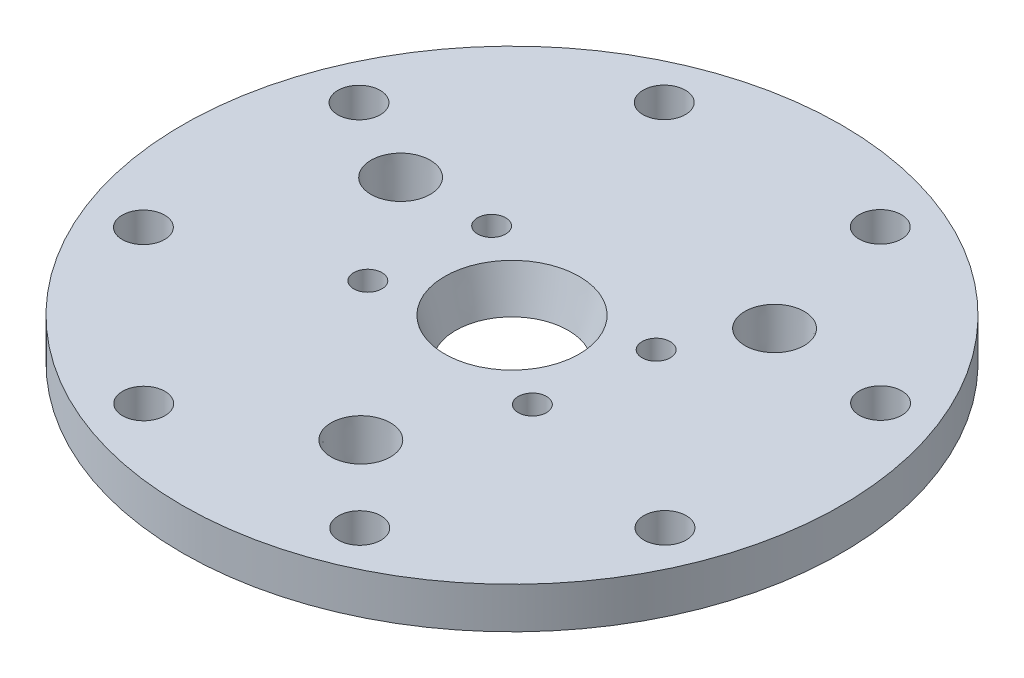
ISO-10303-21;
HEADER;
FILE_DESCRIPTION(('STEP AP214'),'2;1');
FILE_NAME('part.step','',(''),(''),'','','');
FILE_SCHEMA(('AUTOMOTIVE_DESIGN { 1 0 10303 214 1 1 1 1 }'));
ENDSEC;
DATA;
#1=APPLICATION_CONTEXT('core data for automotive mechanical design processes');
#2=APPLICATION_PROTOCOL_DEFINITION('international standard','automotive_design',2000,#1);
#3=PRODUCT_CONTEXT('',#1,'mechanical');
#4=PRODUCT('Part','Part','',(#3));
#5=PRODUCT_RELATED_PRODUCT_CATEGORY('part','',(#4));
#6=PRODUCT_DEFINITION_FORMATION('','',#4);
#7=PRODUCT_DEFINITION_CONTEXT('part definition',#1,'design');
#8=PRODUCT_DEFINITION('design','',#6,#7);
#9=PRODUCT_DEFINITION_SHAPE('','',#8);
#10=(LENGTH_UNIT() NAMED_UNIT(*) SI_UNIT(.MILLI.,.METRE.));
#11=(NAMED_UNIT(*) PLANE_ANGLE_UNIT() SI_UNIT($,.RADIAN.));
#12=(NAMED_UNIT(*) SI_UNIT($,.STERADIAN.) SOLID_ANGLE_UNIT());
#13=UNCERTAINTY_MEASURE_WITH_UNIT(LENGTH_MEASURE(1.E-05),#10,'distance_accuracy_value','');
#14=(GEOMETRIC_REPRESENTATION_CONTEXT(3) GLOBAL_UNCERTAINTY_ASSIGNED_CONTEXT((#13)) GLOBAL_UNIT_ASSIGNED_CONTEXT((#10,
#11,#12)) REPRESENTATION_CONTEXT('',''));
#15=CARTESIAN_POINT('',(0.,0.,0.));
#16=DIRECTION('',(0.,0.,1.));
#17=DIRECTION('',(1.,0.,0.));
#18=AXIS2_PLACEMENT_3D('',#15,#16,#17);
#19=CARTESIAN_POINT('',(0.,0.,0.));
#20=DIRECTION('',(0.,1.,0.));
#21=DIRECTION('',(0.,0.,1.));
#22=AXIS2_PLACEMENT_3D('',#19,#20,#21);
#23=PLANE('',#22);
#24=CARTESIAN_POINT('',(-20.2404270941802,0.,-15.531025957585));
#25=DIRECTION('',(0.,1.,0.));
#26=DIRECTION('',(0.,0.,1.));
#27=AXIS2_PLACEMENT_3D('',#24,#25,#26);
#28=CIRCLE('',#27,3.2639);
#29=CARTESIAN_POINT('',(-20.2404270941802,0.,-12.267125957585));
#30=VERTEX_POINT('',#29);
#31=EDGE_CURVE('E132',#30,#30,#28,.T.);
#32=ORIENTED_EDGE('',*,*,#31,.T.);
#33=EDGE_LOOP('',(#32));
#34=FACE_BOUND('',#33,.T.);
#35=CARTESIAN_POINT('',(20.24042709418,0.,15.531025957585));
#36=DIRECTION('',(0.,1.,0.));
#37=DIRECTION('',(0.,0.,1.));
#38=AXIS2_PLACEMENT_3D('',#35,#36,#37);
#39=CIRCLE('',#38,3.2639);
#40=CARTESIAN_POINT('',(20.24042709418,0.,18.794925957585));
#41=VERTEX_POINT('',#40);
#42=EDGE_CURVE('E126',#41,#41,#39,.T.);
#43=ORIENTED_EDGE('',*,*,#42,.T.);
#44=EDGE_LOOP('',(#43));
#45=FACE_BOUND('',#44,.T.);
#46=CARTESIAN_POINT('',(-23.5704765731943,0.,9.76321106821453));
#47=DIRECTION('',(0.,1.,0.));
#48=DIRECTION('',(0.,0.,1.));
#49=AXIS2_PLACEMENT_3D('',#46,#47,#48);
#50=CIRCLE('',#49,3.2639);
#51=CARTESIAN_POINT('',(-23.5704765731943,0.,13.0271110682145));
#52=VERTEX_POINT('',#51);
#53=EDGE_CURVE('E120',#52,#52,#50,.T.);
#54=ORIENTED_EDGE('',*,*,#53,.T.);
#55=EDGE_LOOP('',(#54));
#56=FACE_BOUND('',#55,.T.);
#57=CARTESIAN_POINT('',(23.570476573194,0.,-9.76321106821436));
#58=DIRECTION('',(0.,1.,0.));
#59=DIRECTION('',(0.,0.,1.));
#60=AXIS2_PLACEMENT_3D('',#57,#58,#59);
#61=CIRCLE('',#60,3.2639);
#62=CARTESIAN_POINT('',(23.570476573194,0.,-6.49931106821436));
#63=VERTEX_POINT('',#62);
#64=EDGE_CURVE('E114',#63,#63,#61,.T.);
#65=ORIENTED_EDGE('',*,*,#64,.T.);
#66=EDGE_LOOP('',(#65));
#67=FACE_BOUND('',#66,.T.);
#68=CARTESIAN_POINT('',(60.2072176605376,0.,-25.0136043709744));
#69=DIRECTION('',(0.,1.,0.));
#70=DIRECTION('',(0.,0.,1.));
#71=AXIS2_PLACEMENT_3D('',#68,#69,#70);
#72=CIRCLE('',#71,4.9022);
#73=CARTESIAN_POINT('',(60.2072176605376,0.,-20.1114043709744));
#74=VERTEX_POINT('',#73);
#75=EDGE_CURVE('E108',#74,#74,#72,.T.);
#76=ORIENTED_EDGE('',*,*,#75,.T.);
#77=EDGE_LOOP('',(#76));
#78=FACE_BOUND('',#77,.T.);
#79=CARTESIAN_POINT('',(60.2573748005619,0.,24.8884947052938));
#80=DIRECTION('',(0.,1.,0.));
#81=DIRECTION('',(0.,0.,1.));
#82=AXIS2_PLACEMENT_3D('',#79,#80,#81);
#83=CIRCLE('',#82,4.9022);
#84=CARTESIAN_POINT('',(60.2573748005619,0.,29.7906947052938));
#85=VERTEX_POINT('',#84);
#86=EDGE_CURVE('E102',#85,#85,#83,.T.);
#87=ORIENTED_EDGE('',*,*,#86,.T.);
#88=EDGE_LOOP('',(#87));
#89=FACE_BOUND('',#88,.T.);
#90=CARTESIAN_POINT('',(24.8856385511014,0.,-60.2642505633118));
#91=DIRECTION('',(0.,1.,0.));
#92=DIRECTION('',(0.,0.,1.));
#93=AXIS2_PLACEMENT_3D('',#90,#91,#92);
#94=CIRCLE('',#93,4.9022);
#95=CARTESIAN_POINT('',(24.8856385511014,0.,-55.3620505633118));
#96=VERTEX_POINT('',#95);
#97=EDGE_CURVE('E96',#96,#96,#94,.T.);
#98=ORIENTED_EDGE('',*,*,#97,.T.);
#99=EDGE_LOOP('',(#98));
#100=FACE_BOUND('',#99,.T.);
#101=CARTESIAN_POINT('',(-25.0164605137829,0.,-60.2140934213461));
#102=DIRECTION('',(0.,1.,0.));
#103=DIRECTION('',(0.,0.,1.));
#104=AXIS2_PLACEMENT_3D('',#101,#102,#103);
#105=CIRCLE('',#104,4.9022);
#106=CARTESIAN_POINT('',(-25.0164605137829,0.,-55.3118934213461));
#107=VERTEX_POINT('',#106);
#108=EDGE_CURVE('E90',#107,#107,#105,.T.);
#109=ORIENTED_EDGE('',*,*,#108,.T.);
#110=EDGE_LOOP('',(#109));
#111=FACE_BOUND('',#110,.T.);
#112=CARTESIAN_POINT('',(-60.2671066994754,0.,-24.8925143346813));
#113=DIRECTION('',(0.,1.,0.));
#114=DIRECTION('',(0.,0.,1.));
#115=AXIS2_PLACEMENT_3D('',#112,#113,#114);
#116=CIRCLE('',#115,4.9022);
#117=CARTESIAN_POINT('',(-60.2671066994754,0.,-19.9903143346813));
#118=VERTEX_POINT('',#117);
#119=EDGE_CURVE('E84',#118,#118,#116,.T.);
#120=ORIENTED_EDGE('',*,*,#119,.T.);
#121=EDGE_LOOP('',(#120));
#122=FACE_BOUND('',#121,.T.);
#123=CARTESIAN_POINT('',(-60.2169495689037,0.,25.0095847188311));
#124=DIRECTION('',(0.,1.,0.));
#125=DIRECTION('',(0.,0.,1.));
#126=AXIS2_PLACEMENT_3D('',#123,#124,#125);
#127=CIRCLE('',#126,4.9022);
#128=CARTESIAN_POINT('',(-60.2169495689037,0.,29.9117847188311));
#129=VERTEX_POINT('',#128);
#130=EDGE_CURVE('E78',#129,#129,#127,.T.);
#131=ORIENTED_EDGE('',*,*,#130,.T.);
#132=EDGE_LOOP('',(#131));
#133=FACE_BOUND('',#132,.T.);
#134=CARTESIAN_POINT('',(-24.8953704822231,0.,60.2602309206212));
#135=DIRECTION('',(0.,1.,0.));
#136=DIRECTION('',(0.,0.,1.));
#137=AXIS2_PLACEMENT_3D('',#134,#135,#136);
#138=CIRCLE('',#137,4.9022);
#139=CARTESIAN_POINT('',(-24.8953704822231,0.,65.1624309206212));
#140=VERTEX_POINT('',#139);
#141=EDGE_CURVE('E72',#140,#140,#138,.T.);
#142=ORIENTED_EDGE('',*,*,#141,.T.);
#143=EDGE_LOOP('',(#142));
#144=FACE_BOUND('',#143,.T.);
#145=CARTESIAN_POINT('',(25.0067285921135,0.,60.2100738014111));
#146=DIRECTION('',(0.,1.,0.));
#147=DIRECTION('',(0.,0.,1.));
#148=AXIS2_PLACEMENT_3D('',#145,#146,#147);
#149=CIRCLE('',#148,4.9022);
#150=CARTESIAN_POINT('',(25.0067285921135,0.,65.1122738014111));
#151=VERTEX_POINT('',#150);
#152=EDGE_CURVE('E66',#151,#151,#149,.T.);
#153=ORIENTED_EDGE('',*,*,#152,.T.);
#154=EDGE_LOOP('',(#153));
#155=FACE_BOUND('',#154,.T.);
#156=CARTESIAN_POINT('',(7.48315115633477,0.,42.4390591063698));
#157=DIRECTION('',(0.,1.,0.));
#158=DIRECTION('',(0.,0.,1.));
#159=AXIS2_PLACEMENT_3D('',#156,#157,#158);
#160=CIRCLE('',#159,6.57280874440069);
#161=CARTESIAN_POINT('',(7.48315115633477,0.,49.0118678507704));
#162=VERTEX_POINT('',#161);
#163=EDGE_CURVE('E60',#162,#162,#160,.T.);
#164=ORIENTED_EDGE('',*,*,#163,.T.);
#165=EDGE_LOOP('',(#164));
#166=FACE_BOUND('',#165,.T.);
#167=CARTESIAN_POINT('',(-40.4948788769928,0.,-14.7389305514403));
#168=DIRECTION('',(0.,1.,0.));
#169=DIRECTION('',(0.,0.,1.));
#170=AXIS2_PLACEMENT_3D('',#167,#168,#169);
#171=CIRCLE('',#170,6.57280874440069);
#172=CARTESIAN_POINT('',(-40.4948788769928,0.,-8.16612180703957));
#173=VERTEX_POINT('',#172);
#174=EDGE_CURVE('E54',#173,#173,#171,.T.);
#175=ORIENTED_EDGE('',*,*,#174,.T.);
#176=EDGE_LOOP('',(#175));
#177=FACE_BOUND('',#176,.T.);
#178=CARTESIAN_POINT('',(33.0117277206584,0.,-27.7001285549294));
#179=DIRECTION('',(0.,1.,0.));
#180=DIRECTION('',(0.,0.,1.));
#181=AXIS2_PLACEMENT_3D('',#178,#179,#180);
#182=CIRCLE('',#181,6.57280874440069);
#183=CARTESIAN_POINT('',(33.0117277206584,0.,-21.1273198105287));
#184=VERTEX_POINT('',#183);
#185=EDGE_CURVE('E35',#184,#184,#182,.T.);
#186=ORIENTED_EDGE('',*,*,#185,.T.);
#187=EDGE_LOOP('',(#186));
#188=FACE_BOUND('',#187,.T.);
#189=CARTESIAN_POINT('',(0.,0.,0.));
#190=DIRECTION('',(0.,-1.,0.));
#191=DIRECTION('',(0.,0.,-1.));
#192=AXIS2_PLACEMENT_3D('',#189,#190,#191);
#193=CIRCLE('',#192,13.);
#194=CARTESIAN_POINT('',(0.,0.,-13.));
#195=VERTEX_POINT('',#194);
#196=EDGE_CURVE('E44',#195,#195,#193,.T.);
#197=ORIENTED_EDGE('',*,*,#196,.F.);
#198=EDGE_LOOP('',(#197));
#199=FACE_BOUND('',#198,.T.);
#200=CARTESIAN_POINT('',(0.,0.,0.));
#201=DIRECTION('',(0.,1.,0.));
#202=DIRECTION('',(0.,0.,1.));
#203=AXIS2_PLACEMENT_3D('',#200,#201,#202);
#204=CIRCLE('',#203,76.2);
#205=CARTESIAN_POINT('',(0.,0.,-76.2));
#206=VERTEX_POINT('',#205);
#207=EDGE_CURVE('E39',#206,#206,#204,.T.);
#208=ORIENTED_EDGE('',*,*,#207,.F.);
#209=EDGE_LOOP('',(#208));
#210=FACE_BOUND('',#209,.T.);
#211=ADVANCED_FACE('F31',(#34,#45,#56,#67,#78,#89,#100,#111,#122,#133,#144,#155,#166,#177,#188,
#199,#210),#23,.F.);
#212=CARTESIAN_POINT('',(0.,9.525,0.));
#213=DIRECTION('',(0.,-1.,0.));
#214=DIRECTION('',(0.,0.,-1.));
#215=AXIS2_PLACEMENT_3D('',#212,#213,#214);
#216=CYLINDRICAL_SURFACE('',#215,76.2);
#217=CARTESIAN_POINT('',(0.,9.525,0.));
#218=DIRECTION('',(0.,1.,0.));
#219=DIRECTION('',(0.,0.,1.));
#220=AXIS2_PLACEMENT_3D('',#217,#218,#219);
#221=CIRCLE('',#220,76.2);
#222=CARTESIAN_POINT('',(0.,9.525,-76.2));
#223=VERTEX_POINT('',#222);
#224=EDGE_CURVE('E10',#223,#223,#221,.T.);
#225=CARTESIAN_POINT('',(0.,9.525,-76.2));
#226=CARTESIAN_POINT('',(0.,9.42578125,-76.2));
#227=CARTESIAN_POINT('',(0.,9.3265625,-76.2));
#228=CARTESIAN_POINT('',(0.,9.128125,-76.2));
#229=CARTESIAN_POINT('',(0.,9.02890625,-76.2));
#230=CARTESIAN_POINT('',(0.,8.83046875,-76.2));
#231=CARTESIAN_POINT('',(0.,8.73125,-76.2));
#232=CARTESIAN_POINT('',(0.,8.5328125,-76.2));
#233=CARTESIAN_POINT('',(0.,8.43359375,-76.2));
#234=CARTESIAN_POINT('',(0.,8.23515625,-76.2));
#235=CARTESIAN_POINT('',(0.,8.1359375,-76.2));
#236=CARTESIAN_POINT('',(0.,7.9375,-76.2));
#237=CARTESIAN_POINT('',(0.,7.83828125,-76.2));
#238=CARTESIAN_POINT('',(0.,7.63984375,-76.2));
#239=CARTESIAN_POINT('',(0.,7.540625,-76.2));
#240=CARTESIAN_POINT('',(0.,7.3421875,-76.2));
#241=CARTESIAN_POINT('',(0.,7.24296875,-76.2));
#242=CARTESIAN_POINT('',(0.,7.04453125,-76.2));
#243=CARTESIAN_POINT('',(0.,6.9453125,-76.2));
#244=CARTESIAN_POINT('',(0.,6.746875,-76.2));
#245=CARTESIAN_POINT('',(0.,6.64765625,-76.2));
#246=CARTESIAN_POINT('',(0.,6.44921875,-76.2));
#247=CARTESIAN_POINT('',(0.,6.35,-76.2));
#248=CARTESIAN_POINT('',(0.,6.1515625,-76.2));
#249=CARTESIAN_POINT('',(0.,6.05234375,-76.2));
#250=CARTESIAN_POINT('',(0.,5.85390625,-76.2));
#251=CARTESIAN_POINT('',(0.,5.7546875,-76.2));
#252=CARTESIAN_POINT('',(0.,5.55625,-76.2));
#253=CARTESIAN_POINT('',(0.,5.45703125,-76.2));
#254=CARTESIAN_POINT('',(0.,5.25859375,-76.2));
#255=CARTESIAN_POINT('',(0.,5.159375,-76.2));
#256=CARTESIAN_POINT('',(0.,4.9609375,-76.2));
#257=CARTESIAN_POINT('',(0.,4.86171875,-76.2));
#258=CARTESIAN_POINT('',(0.,4.66328125,-76.2));
#259=CARTESIAN_POINT('',(0.,4.5640625,-76.2));
#260=CARTESIAN_POINT('',(0.,4.365625,-76.2));
#261=CARTESIAN_POINT('',(0.,4.26640625,-76.2));
#262=CARTESIAN_POINT('',(0.,4.06796875,-76.2));
#263=CARTESIAN_POINT('',(0.,3.96875,-76.2));
#264=CARTESIAN_POINT('',(0.,3.7703125,-76.2));
#265=CARTESIAN_POINT('',(0.,3.67109375,-76.2));
#266=CARTESIAN_POINT('',(0.,3.47265625,-76.2));
#267=CARTESIAN_POINT('',(0.,3.3734375,-76.2));
#268=CARTESIAN_POINT('',(0.,3.175,-76.2));
#269=CARTESIAN_POINT('',(0.,3.07578125,-76.2));
#270=CARTESIAN_POINT('',(0.,2.87734375,-76.2));
#271=CARTESIAN_POINT('',(0.,2.778125,-76.2));
#272=CARTESIAN_POINT('',(0.,2.5796875,-76.2));
#273=CARTESIAN_POINT('',(0.,2.48046875,-76.2));
#274=CARTESIAN_POINT('',(0.,2.28203125,-76.2));
#275=CARTESIAN_POINT('',(0.,2.1828125,-76.2));
#276=CARTESIAN_POINT('',(0.,1.984375,-76.2));
#277=CARTESIAN_POINT('',(0.,1.88515625,-76.2));
#278=CARTESIAN_POINT('',(0.,1.68671875,-76.2));
#279=CARTESIAN_POINT('',(0.,1.5875,-76.2));
#280=CARTESIAN_POINT('',(0.,1.3890625,-76.2));
#281=CARTESIAN_POINT('',(0.,1.28984375,-76.2));
#282=CARTESIAN_POINT('',(0.,1.09140625,-76.2));
#283=CARTESIAN_POINT('',(0.,0.992187500000001,-76.2));
#284=CARTESIAN_POINT('',(0.,0.793750000000001,-76.2));
#285=CARTESIAN_POINT('',(0.,0.69453125,-76.2));
#286=CARTESIAN_POINT('',(0.,0.49609375,-76.2));
#287=CARTESIAN_POINT('',(0.,0.396875,-76.2));
#288=CARTESIAN_POINT('',(0.,0.1984375,-76.2));
#289=CARTESIAN_POINT('',(0.,0.0992187500000001,-76.2));
#290=CARTESIAN_POINT('',(0.,0.,-76.2));
#291=B_SPLINE_CURVE_WITH_KNOTS('',3,(#225,#226,#227,#228,#229,#230,#231,#232,#233,#234,#235,
#236,#237,#238,#239,#240,#241,#242,#243,#244,#245,#246,#247,#248,#249,#250,#251,#252,#253,#254,
#255,#256,#257,#258,#259,#260,#261,#262,#263,#264,#265,#266,#267,#268,#269,#270,#271,#272,#273,
#274,#275,#276,#277,#278,#279,#280,#281,#282,#283,#284,#285,#286,#287,#288,#289,#290),
.UNSPECIFIED.,.F.,.F.,(4,2,2,2,2,2,2,2,2,2,2,2,2,2,2,2,2,2,2,2,2,2,2,2,2,2,2,2,2,2,2,2,4),(0.,
0.29765625,0.5953125,0.892968750000001,1.190625,1.48828125,1.7859375,2.08359375,2.38125,
2.67890625,2.9765625,3.27421875,3.571875,3.86953125,4.1671875,4.46484375,4.7625,5.06015625,
5.3578125,5.65546875,5.953125,6.25078125,6.5484375,6.84609375,7.14375,7.44140625,7.7390625,
8.03671875,8.334375,8.63203125,8.9296875,9.22734375,9.525),.UNSPECIFIED.);
#292=EDGE_CURVE('BSEAM33',#223,#206,#291,.T.);
#293=ORIENTED_EDGE('',*,*,#224,.F.);
#294=ORIENTED_EDGE('',*,*,#207,.T.);
#295=ORIENTED_EDGE('',*,*,#292,.T.);
#296=ORIENTED_EDGE('',*,*,#292,.F.);
#297=EDGE_LOOP('',(#293,#295,#294,#296));
#298=FACE_BOUND('',#297,.T.);
#299=ADVANCED_FACE('F33',(#298),#216,.T.);
#300=CARTESIAN_POINT('',(0.,9.525,0.));
#301=DIRECTION('',(0.,1.,0.));
#302=DIRECTION('',(0.,0.,1.));
#303=AXIS2_PLACEMENT_3D('',#300,#301,#302);
#304=PLANE('',#303);
#305=CARTESIAN_POINT('',(-20.2404270941802,9.525,-15.531025957585));
#306=DIRECTION('',(0.,1.,0.));
#307=DIRECTION('',(0.,0.,1.));
#308=AXIS2_PLACEMENT_3D('',#305,#306,#307);
#309=CIRCLE('',#308,3.2639);
#310=CARTESIAN_POINT('',(-20.2404270941802,9.525,-12.267125957585));
#311=VERTEX_POINT('',#310);
#312=EDGE_CURVE('E135',#311,#311,#309,.T.);
#313=ORIENTED_EDGE('',*,*,#312,.F.);
#314=EDGE_LOOP('',(#313));
#315=FACE_BOUND('',#314,.T.);
#316=CARTESIAN_POINT('',(20.24042709418,9.525,15.531025957585));
#317=DIRECTION('',(0.,1.,0.));
#318=DIRECTION('',(0.,0.,1.));
#319=AXIS2_PLACEMENT_3D('',#316,#317,#318);
#320=CIRCLE('',#319,3.2639);
#321=CARTESIAN_POINT('',(20.24042709418,9.525,18.794925957585));
#322=VERTEX_POINT('',#321);
#323=EDGE_CURVE('E129',#322,#322,#320,.T.);
#324=ORIENTED_EDGE('',*,*,#323,.F.);
#325=EDGE_LOOP('',(#324));
#326=FACE_BOUND('',#325,.T.);
#327=CARTESIAN_POINT('',(-23.5704765731943,9.525,9.76321106821453));
#328=DIRECTION('',(0.,1.,0.));
#329=DIRECTION('',(0.,0.,1.));
#330=AXIS2_PLACEMENT_3D('',#327,#328,#329);
#331=CIRCLE('',#330,3.2639);
#332=CARTESIAN_POINT('',(-23.5704765731943,9.525,13.0271110682145));
#333=VERTEX_POINT('',#332);
#334=EDGE_CURVE('E123',#333,#333,#331,.T.);
#335=ORIENTED_EDGE('',*,*,#334,.F.);
#336=EDGE_LOOP('',(#335));
#337=FACE_BOUND('',#336,.T.);
#338=CARTESIAN_POINT('',(23.570476573194,9.525,-9.76321106821436));
#339=DIRECTION('',(0.,1.,0.));
#340=DIRECTION('',(0.,0.,1.));
#341=AXIS2_PLACEMENT_3D('',#338,#339,#340);
#342=CIRCLE('',#341,3.2639);
#343=CARTESIAN_POINT('',(23.570476573194,9.525,-6.49931106821437));
#344=VERTEX_POINT('',#343);
#345=EDGE_CURVE('E117',#344,#344,#342,.T.);
#346=ORIENTED_EDGE('',*,*,#345,.F.);
#347=EDGE_LOOP('',(#346));
#348=FACE_BOUND('',#347,.T.);
#349=CARTESIAN_POINT('',(60.2072176605376,9.525,-25.0136043709744));
#350=DIRECTION('',(0.,1.,0.));
#351=DIRECTION('',(0.,0.,1.));
#352=AXIS2_PLACEMENT_3D('',#349,#350,#351);
#353=CIRCLE('',#352,4.9022);
#354=CARTESIAN_POINT('',(60.2072176605376,9.525,-20.1114043709744));
#355=VERTEX_POINT('',#354);
#356=EDGE_CURVE('E111',#355,#355,#353,.T.);
#357=ORIENTED_EDGE('',*,*,#356,.F.);
#358=EDGE_LOOP('',(#357));
#359=FACE_BOUND('',#358,.T.);
#360=CARTESIAN_POINT('',(60.2573748005619,9.525,24.8884947052938));
#361=DIRECTION('',(0.,1.,0.));
#362=DIRECTION('',(0.,0.,1.));
#363=AXIS2_PLACEMENT_3D('',#360,#361,#362);
#364=CIRCLE('',#363,4.9022);
#365=CARTESIAN_POINT('',(60.2573748005619,9.525,29.7906947052938));
#366=VERTEX_POINT('',#365);
#367=EDGE_CURVE('E105',#366,#366,#364,.T.);
#368=ORIENTED_EDGE('',*,*,#367,.F.);
#369=EDGE_LOOP('',(#368));
#370=FACE_BOUND('',#369,.T.);
#371=CARTESIAN_POINT('',(24.8856385511014,9.525,-60.2642505633118));
#372=DIRECTION('',(0.,1.,0.));
#373=DIRECTION('',(0.,0.,1.));
#374=AXIS2_PLACEMENT_3D('',#371,#372,#373);
#375=CIRCLE('',#374,4.9022);
#376=CARTESIAN_POINT('',(24.8856385511014,9.525,-55.3620505633118));
#377=VERTEX_POINT('',#376);
#378=EDGE_CURVE('E99',#377,#377,#375,.T.);
#379=ORIENTED_EDGE('',*,*,#378,.F.);
#380=EDGE_LOOP('',(#379));
#381=FACE_BOUND('',#380,.T.);
#382=CARTESIAN_POINT('',(-25.0164605137829,9.525,-60.2140934213461));
#383=DIRECTION('',(0.,1.,0.));
#384=DIRECTION('',(0.,0.,1.));
#385=AXIS2_PLACEMENT_3D('',#382,#383,#384);
#386=CIRCLE('',#385,4.9022);
#387=CARTESIAN_POINT('',(-25.0164605137829,9.525,-55.3118934213461));
#388=VERTEX_POINT('',#387);
#389=EDGE_CURVE('E93',#388,#388,#386,.T.);
#390=ORIENTED_EDGE('',*,*,#389,.F.);
#391=EDGE_LOOP('',(#390));
#392=FACE_BOUND('',#391,.T.);
#393=CARTESIAN_POINT('',(-60.2671066994754,9.525,-24.8925143346813));
#394=DIRECTION('',(0.,1.,0.));
#395=DIRECTION('',(0.,0.,1.));
#396=AXIS2_PLACEMENT_3D('',#393,#394,#395);
#397=CIRCLE('',#396,4.9022);
#398=CARTESIAN_POINT('',(-60.2671066994754,9.525,-19.9903143346813));
#399=VERTEX_POINT('',#398);
#400=EDGE_CURVE('E87',#399,#399,#397,.T.);
#401=ORIENTED_EDGE('',*,*,#400,.F.);
#402=EDGE_LOOP('',(#401));
#403=FACE_BOUND('',#402,.T.);
#404=CARTESIAN_POINT('',(-60.2169495689037,9.525,25.0095847188311));
#405=DIRECTION('',(0.,1.,0.));
#406=DIRECTION('',(0.,0.,1.));
#407=AXIS2_PLACEMENT_3D('',#404,#405,#406);
#408=CIRCLE('',#407,4.9022);
#409=CARTESIAN_POINT('',(-60.2169495689037,9.525,29.9117847188311));
#410=VERTEX_POINT('',#409);
#411=EDGE_CURVE('E81',#410,#410,#408,.T.);
#412=ORIENTED_EDGE('',*,*,#411,.F.);
#413=EDGE_LOOP('',(#412));
#414=FACE_BOUND('',#413,.T.);
#415=CARTESIAN_POINT('',(-24.8953704822231,9.525,60.2602309206212));
#416=DIRECTION('',(0.,1.,0.));
#417=DIRECTION('',(0.,0.,1.));
#418=AXIS2_PLACEMENT_3D('',#415,#416,#417);
#419=CIRCLE('',#418,4.9022);
#420=CARTESIAN_POINT('',(-24.8953704822231,9.525,65.1624309206212));
#421=VERTEX_POINT('',#420);
#422=EDGE_CURVE('E75',#421,#421,#419,.T.);
#423=ORIENTED_EDGE('',*,*,#422,.F.);
#424=EDGE_LOOP('',(#423));
#425=FACE_BOUND('',#424,.T.);
#426=CARTESIAN_POINT('',(25.0067285921135,9.525,60.2100738014111));
#427=DIRECTION('',(0.,1.,0.));
#428=DIRECTION('',(0.,0.,1.));
#429=AXIS2_PLACEMENT_3D('',#426,#427,#428);
#430=CIRCLE('',#429,4.9022);
#431=CARTESIAN_POINT('',(25.0067285921135,9.525,65.1122738014111));
#432=VERTEX_POINT('',#431);
#433=EDGE_CURVE('E69',#432,#432,#430,.T.);
#434=ORIENTED_EDGE('',*,*,#433,.F.);
#435=EDGE_LOOP('',(#434));
#436=FACE_BOUND('',#435,.T.);
#437=CARTESIAN_POINT('',(7.48315115633477,9.525,42.4390591063698));
#438=DIRECTION('',(0.,1.,0.));
#439=DIRECTION('',(0.,0.,1.));
#440=AXIS2_PLACEMENT_3D('',#437,#438,#439);
#441=CIRCLE('',#440,6.858);
#442=CARTESIAN_POINT('',(7.48315115633477,9.525,49.2970591063698));
#443=VERTEX_POINT('',#442);
#444=EDGE_CURVE('E63',#443,#443,#441,.T.);
#445=ORIENTED_EDGE('',*,*,#444,.F.);
#446=EDGE_LOOP('',(#445));
#447=FACE_BOUND('',#446,.T.);
#448=CARTESIAN_POINT('',(-40.4948788769928,9.525,-14.7389305514403));
#449=DIRECTION('',(0.,1.,0.));
#450=DIRECTION('',(0.,0.,1.));
#451=AXIS2_PLACEMENT_3D('',#448,#449,#450);
#452=CIRCLE('',#451,6.858);
#453=CARTESIAN_POINT('',(-40.4948788769928,9.525,-7.88093055144026));
#454=VERTEX_POINT('',#453);
#455=EDGE_CURVE('E57',#454,#454,#452,.T.);
#456=ORIENTED_EDGE('',*,*,#455,.F.);
#457=EDGE_LOOP('',(#456));
#458=FACE_BOUND('',#457,.T.);
#459=CARTESIAN_POINT('',(33.0117277206584,9.525,-27.7001285549294));
#460=DIRECTION('',(0.,1.,0.));
#461=DIRECTION('',(0.,0.,1.));
#462=AXIS2_PLACEMENT_3D('',#459,#460,#461);
#463=CIRCLE('',#462,6.858);
#464=CARTESIAN_POINT('',(33.0117277206584,9.525,-20.8421285549294));
#465=VERTEX_POINT('',#464);
#466=EDGE_CURVE('E51',#465,#465,#463,.T.);
#467=ORIENTED_EDGE('',*,*,#466,.F.);
#468=EDGE_LOOP('',(#467));
#469=FACE_BOUND('',#468,.T.);
#470=CARTESIAN_POINT('',(0.,9.525,0.));
#471=DIRECTION('',(0.,-1.,0.));
#472=DIRECTION('',(0.,0.,-1.));
#473=AXIS2_PLACEMENT_3D('',#470,#471,#472);
#474=CIRCLE('',#473,15.5522160579064);
#475=CARTESIAN_POINT('',(0.,9.525,-15.5522160579064));
#476=VERTEX_POINT('',#475);
#477=EDGE_CURVE('E48',#476,#476,#474,.T.);
#478=ORIENTED_EDGE('',*,*,#477,.T.);
#479=EDGE_LOOP('',(#478));
#480=FACE_BOUND('',#479,.T.);
#481=ORIENTED_EDGE('',*,*,#224,.T.);
#482=EDGE_LOOP('',(#481));
#483=FACE_BOUND('',#482,.T.);
#484=ADVANCED_FACE('F141',(#315,#326,#337,#348,#359,#370,#381,#392,#403,#414,#425,#436,#447,
#458,#469,#480,#483),#304,.T.);
#485=CARTESIAN_POINT('',(0.,0.,0.));
#486=DIRECTION('',(0.,1.,0.));
#487=DIRECTION('',(0.,0.,1.));
#488=AXIS2_PLACEMENT_3D('',#485,#486,#487);
#489=CONICAL_SURFACE('',#488,13.,0.261799387799149);
#490=ORIENTED_EDGE('',*,*,#477,.F.);
#491=EDGE_LOOP('',(#490));
#492=FACE_BOUND('',#491,.T.);
#493=ORIENTED_EDGE('',*,*,#196,.T.);
#494=EDGE_LOOP('',(#493));
#495=FACE_BOUND('',#494,.T.);
#496=ADVANCED_FACE('F144',(#492,#495),#489,.F.);
#497=CARTESIAN_POINT('',(33.0117277206584,9.525,-27.7001285549294));
#498=DIRECTION('',(0.,1.,0.));
#499=DIRECTION('',(0.,0.,1.));
#500=AXIS2_PLACEMENT_3D('',#497,#498,#499);
#501=CONICAL_SURFACE('',#500,6.858,0.0299323966717029);
#502=ORIENTED_EDGE('',*,*,#466,.T.);
#503=EDGE_LOOP('',(#502));
#504=FACE_BOUND('',#503,.T.);
#505=ORIENTED_EDGE('',*,*,#185,.F.);
#506=EDGE_LOOP('',(#505));
#507=FACE_BOUND('',#506,.T.);
#508=ADVANCED_FACE('F178',(#504,#507),#501,.F.);
#509=CARTESIAN_POINT('',(-40.4948788769928,9.525,-14.7389305514403));
#510=DIRECTION('',(0.,1.,0.));
#511=DIRECTION('',(0.,0.,1.));
#512=AXIS2_PLACEMENT_3D('',#509,#510,#511);
#513=CONICAL_SURFACE('',#512,6.858,0.0299323966717029);
#514=ORIENTED_EDGE('',*,*,#455,.T.);
#515=EDGE_LOOP('',(#514));
#516=FACE_BOUND('',#515,.T.);
#517=ORIENTED_EDGE('',*,*,#174,.F.);
#518=EDGE_LOOP('',(#517));
#519=FACE_BOUND('',#518,.T.);
#520=ADVANCED_FACE('F208',(#516,#519),#513,.F.);
#521=CARTESIAN_POINT('',(7.48315115633477,9.525,42.4390591063698));
#522=DIRECTION('',(0.,1.,0.));
#523=DIRECTION('',(0.,0.,1.));
#524=AXIS2_PLACEMENT_3D('',#521,#522,#523);
#525=CONICAL_SURFACE('',#524,6.858,0.0299323966717028);
#526=ORIENTED_EDGE('',*,*,#444,.T.);
#527=EDGE_LOOP('',(#526));
#528=FACE_BOUND('',#527,.T.);
#529=ORIENTED_EDGE('',*,*,#163,.F.);
#530=EDGE_LOOP('',(#529));
#531=FACE_BOUND('',#530,.T.);
#532=ADVANCED_FACE('F216',(#528,#531),#525,.F.);
#533=CARTESIAN_POINT('',(25.0067285921135,9.525,60.2100738014111));
#534=DIRECTION('',(0.,1.,0.));
#535=DIRECTION('',(0.,0.,1.));
#536=AXIS2_PLACEMENT_3D('',#533,#534,#535);
#537=CYLINDRICAL_SURFACE('',#536,4.9022);
#538=ORIENTED_EDGE('',*,*,#152,.F.);
#539=EDGE_LOOP('',(#538));
#540=FACE_BOUND('',#539,.T.);
#541=ORIENTED_EDGE('',*,*,#433,.T.);
#542=EDGE_LOOP('',(#541));
#543=FACE_BOUND('',#542,.T.);
#544=ADVANCED_FACE('F224',(#540,#543),#537,.F.);
#545=CARTESIAN_POINT('',(-24.8953704822231,9.525,60.2602309206212));
#546=DIRECTION('',(0.,1.,0.));
#547=DIRECTION('',(0.,0.,1.));
#548=AXIS2_PLACEMENT_3D('',#545,#546,#547);
#549=CYLINDRICAL_SURFACE('',#548,4.9022);
#550=ORIENTED_EDGE('',*,*,#141,.F.);
#551=EDGE_LOOP('',(#550));
#552=FACE_BOUND('',#551,.T.);
#553=ORIENTED_EDGE('',*,*,#422,.T.);
#554=EDGE_LOOP('',(#553));
#555=FACE_BOUND('',#554,.T.);
#556=ADVANCED_FACE('F232',(#552,#555),#549,.F.);
#557=CARTESIAN_POINT('',(-60.2169495689037,9.525,25.0095847188311));
#558=DIRECTION('',(0.,1.,0.));
#559=DIRECTION('',(0.,0.,1.));
#560=AXIS2_PLACEMENT_3D('',#557,#558,#559);
#561=CYLINDRICAL_SURFACE('',#560,4.9022);
#562=ORIENTED_EDGE('',*,*,#130,.F.);
#563=EDGE_LOOP('',(#562));
#564=FACE_BOUND('',#563,.T.);
#565=ORIENTED_EDGE('',*,*,#411,.T.);
#566=EDGE_LOOP('',(#565));
#567=FACE_BOUND('',#566,.T.);
#568=ADVANCED_FACE('F240',(#564,#567),#561,.F.);
#569=CARTESIAN_POINT('',(-60.2671066994754,9.525,-24.8925143346813));
#570=DIRECTION('',(0.,1.,0.));
#571=DIRECTION('',(0.,0.,1.));
#572=AXIS2_PLACEMENT_3D('',#569,#570,#571);
#573=CYLINDRICAL_SURFACE('',#572,4.9022);
#574=ORIENTED_EDGE('',*,*,#119,.F.);
#575=EDGE_LOOP('',(#574));
#576=FACE_BOUND('',#575,.T.);
#577=ORIENTED_EDGE('',*,*,#400,.T.);
#578=EDGE_LOOP('',(#577));
#579=FACE_BOUND('',#578,.T.);
#580=ADVANCED_FACE('F248',(#576,#579),#573,.F.);
#581=CARTESIAN_POINT('',(-25.0164605137829,9.525,-60.2140934213461));
#582=DIRECTION('',(0.,1.,0.));
#583=DIRECTION('',(0.,0.,1.));
#584=AXIS2_PLACEMENT_3D('',#581,#582,#583);
#585=CYLINDRICAL_SURFACE('',#584,4.9022);
#586=ORIENTED_EDGE('',*,*,#108,.F.);
#587=EDGE_LOOP('',(#586));
#588=FACE_BOUND('',#587,.T.);
#589=ORIENTED_EDGE('',*,*,#389,.T.);
#590=EDGE_LOOP('',(#589));
#591=FACE_BOUND('',#590,.T.);
#592=ADVANCED_FACE('F256',(#588,#591),#585,.F.);
#593=CARTESIAN_POINT('',(24.8856385511014,9.525,-60.2642505633118));
#594=DIRECTION('',(0.,1.,0.));
#595=DIRECTION('',(0.,0.,1.));
#596=AXIS2_PLACEMENT_3D('',#593,#594,#595);
#597=CYLINDRICAL_SURFACE('',#596,4.9022);
#598=ORIENTED_EDGE('',*,*,#97,.F.);
#599=EDGE_LOOP('',(#598));
#600=FACE_BOUND('',#599,.T.);
#601=ORIENTED_EDGE('',*,*,#378,.T.);
#602=EDGE_LOOP('',(#601));
#603=FACE_BOUND('',#602,.T.);
#604=ADVANCED_FACE('F264',(#600,#603),#597,.F.);
#605=CARTESIAN_POINT('',(60.2573748005619,9.525,24.8884947052938));
#606=DIRECTION('',(0.,1.,0.));
#607=DIRECTION('',(0.,0.,1.));
#608=AXIS2_PLACEMENT_3D('',#605,#606,#607);
#609=CYLINDRICAL_SURFACE('',#608,4.9022);
#610=ORIENTED_EDGE('',*,*,#86,.F.);
#611=EDGE_LOOP('',(#610));
#612=FACE_BOUND('',#611,.T.);
#613=ORIENTED_EDGE('',*,*,#367,.T.);
#614=EDGE_LOOP('',(#613));
#615=FACE_BOUND('',#614,.T.);
#616=ADVANCED_FACE('F272',(#612,#615),#609,.F.);
#617=CARTESIAN_POINT('',(60.2072176605376,9.525,-25.0136043709744));
#618=DIRECTION('',(0.,1.,0.));
#619=DIRECTION('',(0.,0.,1.));
#620=AXIS2_PLACEMENT_3D('',#617,#618,#619);
#621=CYLINDRICAL_SURFACE('',#620,4.9022);
#622=ORIENTED_EDGE('',*,*,#75,.F.);
#623=EDGE_LOOP('',(#622));
#624=FACE_BOUND('',#623,.T.);
#625=ORIENTED_EDGE('',*,*,#356,.T.);
#626=EDGE_LOOP('',(#625));
#627=FACE_BOUND('',#626,.T.);
#628=ADVANCED_FACE('F280',(#624,#627),#621,.F.);
#629=CARTESIAN_POINT('',(23.570476573194,9.525,-9.76321106821436));
#630=DIRECTION('',(0.,1.,0.));
#631=DIRECTION('',(0.,0.,1.));
#632=AXIS2_PLACEMENT_3D('',#629,#630,#631);
#633=CYLINDRICAL_SURFACE('',#632,3.2639);
#634=ORIENTED_EDGE('',*,*,#64,.F.);
#635=EDGE_LOOP('',(#634));
#636=FACE_BOUND('',#635,.T.);
#637=ORIENTED_EDGE('',*,*,#345,.T.);
#638=EDGE_LOOP('',(#637));
#639=FACE_BOUND('',#638,.T.);
#640=ADVANCED_FACE('F288',(#636,#639),#633,.F.);
#641=CARTESIAN_POINT('',(-23.5704765731943,9.525,9.76321106821453));
#642=DIRECTION('',(0.,1.,0.));
#643=DIRECTION('',(0.,0.,1.));
#644=AXIS2_PLACEMENT_3D('',#641,#642,#643);
#645=CYLINDRICAL_SURFACE('',#644,3.2639);
#646=ORIENTED_EDGE('',*,*,#53,.F.);
#647=EDGE_LOOP('',(#646));
#648=FACE_BOUND('',#647,.T.);
#649=ORIENTED_EDGE('',*,*,#334,.T.);
#650=EDGE_LOOP('',(#649));
#651=FACE_BOUND('',#650,.T.);
#652=ADVANCED_FACE('F295',(#648,#651),#645,.F.);
#653=CARTESIAN_POINT('',(20.24042709418,9.525,15.531025957585));
#654=DIRECTION('',(0.,1.,0.));
#655=DIRECTION('',(0.,0.,1.));
#656=AXIS2_PLACEMENT_3D('',#653,#654,#655);
#657=CYLINDRICAL_SURFACE('',#656,3.2639);
#658=ORIENTED_EDGE('',*,*,#42,.F.);
#659=EDGE_LOOP('',(#658));
#660=FACE_BOUND('',#659,.T.);
#661=ORIENTED_EDGE('',*,*,#323,.T.);
#662=EDGE_LOOP('',(#661));
#663=FACE_BOUND('',#662,.T.);
#664=ADVANCED_FACE('F303',(#660,#663),#657,.F.);
#665=CARTESIAN_POINT('',(-20.2404270941802,9.525,-15.531025957585));
#666=DIRECTION('',(0.,1.,0.));
#667=DIRECTION('',(0.,0.,1.));
#668=AXIS2_PLACEMENT_3D('',#665,#666,#667);
#669=CYLINDRICAL_SURFACE('',#668,3.2639);
#670=ORIENTED_EDGE('',*,*,#31,.F.);
#671=EDGE_LOOP('',(#670));
#672=FACE_BOUND('',#671,.T.);
#673=ORIENTED_EDGE('',*,*,#312,.T.);
#674=EDGE_LOOP('',(#673));
#675=FACE_BOUND('',#674,.T.);
#676=ADVANCED_FACE('F139',(#672,#675),#669,.F.);
#677=CLOSED_SHELL('',(#211,#299,#484,#496,#508,#520,#532,#544,#556,#568,#580,#592,#604,#616,
#628,#640,#652,#664,#676));
#678=MANIFOLD_SOLID_BREP('B2',#677);
#679=ADVANCED_BREP_SHAPE_REPRESENTATION('',(#18,#678),#14);
#680=SHAPE_DEFINITION_REPRESENTATION(#9,#679);
ENDSEC;
END-ISO-10303-21;
